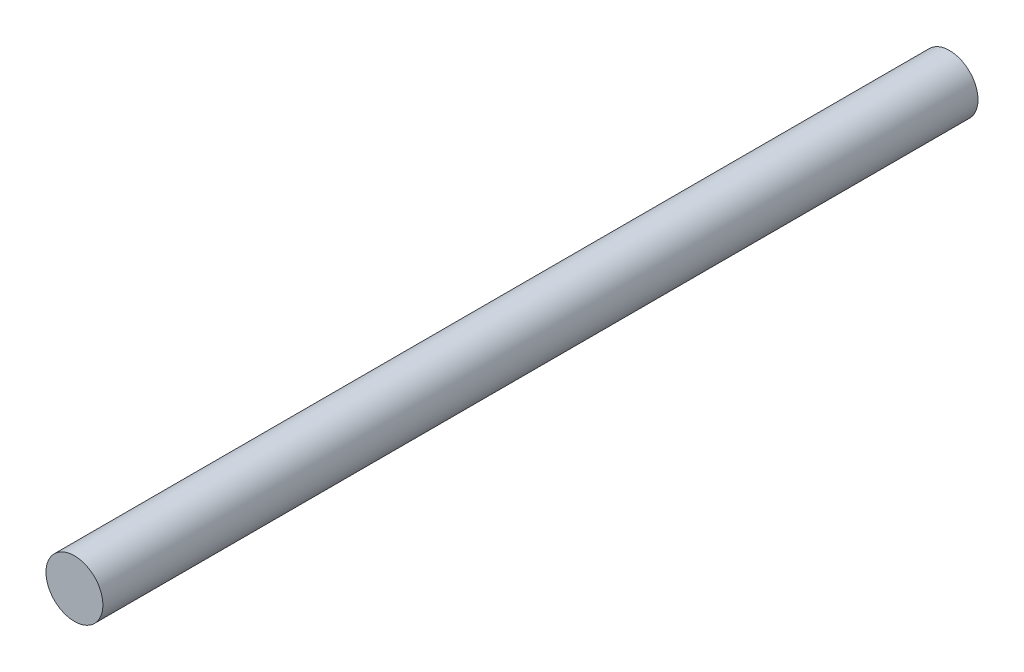
ISO-10303-21;
HEADER;
FILE_DESCRIPTION(('STEP AP214'),'2;1');
FILE_NAME('part.step','',(''),(''),'','','');
FILE_SCHEMA(('AUTOMOTIVE_DESIGN { 1 0 10303 214 1 1 1 1 }'));
ENDSEC;
DATA;
#1=APPLICATION_CONTEXT('core data for automotive mechanical design processes');
#2=APPLICATION_PROTOCOL_DEFINITION('international standard','automotive_design',2000,#1);
#3=PRODUCT_CONTEXT('',#1,'mechanical');
#4=PRODUCT('Part','Part','',(#3));
#5=PRODUCT_RELATED_PRODUCT_CATEGORY('part','',(#4));
#6=PRODUCT_DEFINITION_FORMATION('','',#4);
#7=PRODUCT_DEFINITION_CONTEXT('part definition',#1,'design');
#8=PRODUCT_DEFINITION('design','',#6,#7);
#9=PRODUCT_DEFINITION_SHAPE('','',#8);
#10=(LENGTH_UNIT() NAMED_UNIT(*) SI_UNIT(.MILLI.,.METRE.));
#11=(NAMED_UNIT(*) PLANE_ANGLE_UNIT() SI_UNIT($,.RADIAN.));
#12=(NAMED_UNIT(*) SI_UNIT($,.STERADIAN.) SOLID_ANGLE_UNIT());
#13=UNCERTAINTY_MEASURE_WITH_UNIT(LENGTH_MEASURE(1.E-05),#10,'distance_accuracy_value','');
#14=(GEOMETRIC_REPRESENTATION_CONTEXT(3) GLOBAL_UNCERTAINTY_ASSIGNED_CONTEXT((#13)) GLOBAL_UNIT_ASSIGNED_CONTEXT((#10,
#11,#12)) REPRESENTATION_CONTEXT('',''));
#15=CARTESIAN_POINT('',(0.,0.,0.));
#16=DIRECTION('',(0.,0.,1.));
#17=DIRECTION('',(1.,0.,0.));
#18=AXIS2_PLACEMENT_3D('',#15,#16,#17);
#19=CARTESIAN_POINT('',(0.,0.,230.51));
#20=DIRECTION('',(0.,0.,-1.));
#21=DIRECTION('',(-1.,0.,0.));
#22=AXIS2_PLACEMENT_3D('',#19,#20,#21);
#23=CYLINDRICAL_SURFACE('',#22,7.5);
#24=CARTESIAN_POINT('',(0.,0.,230.51));
#25=DIRECTION('',(0.,0.,1.));
#26=DIRECTION('',(1.,0.,0.));
#27=AXIS2_PLACEMENT_3D('',#24,#25,#26);
#28=CIRCLE('',#27,7.5);
#29=CARTESIAN_POINT('',(7.5,0.,230.51));
#30=VERTEX_POINT('',#29);
#31=EDGE_CURVE('E10',#30,#30,#28,.T.);
#32=ORIENTED_EDGE('',*,*,#31,.F.);
#33=EDGE_LOOP('',(#32));
#34=FACE_BOUND('',#33,.T.);
#35=CARTESIAN_POINT('',(0.,0.,0.));
#36=DIRECTION('',(0.,0.,1.));
#37=DIRECTION('',(1.,0.,0.));
#38=AXIS2_PLACEMENT_3D('',#35,#36,#37);
#39=CIRCLE('',#38,7.5);
#40=CARTESIAN_POINT('',(7.5,0.,0.));
#41=VERTEX_POINT('',#40);
#42=EDGE_CURVE('E46',#41,#41,#39,.T.);
#43=ORIENTED_EDGE('',*,*,#42,.T.);
#44=EDGE_LOOP('',(#43));
#45=FACE_BOUND('',#44,.T.);
#46=ADVANCED_FACE('F43',(#34,#45),#23,.T.);
#47=CARTESIAN_POINT('',(0.,0.,230.51));
#48=DIRECTION('',(0.,0.,1.));
#49=DIRECTION('',(1.,0.,0.));
#50=AXIS2_PLACEMENT_3D('',#47,#48,#49);
#51=PLANE('',#50);
#52=ORIENTED_EDGE('',*,*,#31,.T.);
#53=EDGE_LOOP('',(#52));
#54=FACE_BOUND('',#53,.T.);
#55=ADVANCED_FACE('F58',(#54),#51,.T.);
#56=CARTESIAN_POINT('',(0.,0.,0.));
#57=DIRECTION('',(0.,0.,1.));
#58=DIRECTION('',(1.,0.,0.));
#59=AXIS2_PLACEMENT_3D('',#56,#57,#58);
#60=PLANE('',#59);
#61=ORIENTED_EDGE('',*,*,#42,.F.);
#62=EDGE_LOOP('',(#61));
#63=FACE_BOUND('',#62,.T.);
#64=ADVANCED_FACE('F56',(#63),#60,.F.);
#65=CLOSED_SHELL('',(#46,#55,#64));
#66=MANIFOLD_SOLID_BREP('B2',#65);
#67=ADVANCED_BREP_SHAPE_REPRESENTATION('',(#18,#66),#14);
#68=SHAPE_DEFINITION_REPRESENTATION(#9,#67);
ENDSEC;
END-ISO-10303-21;
